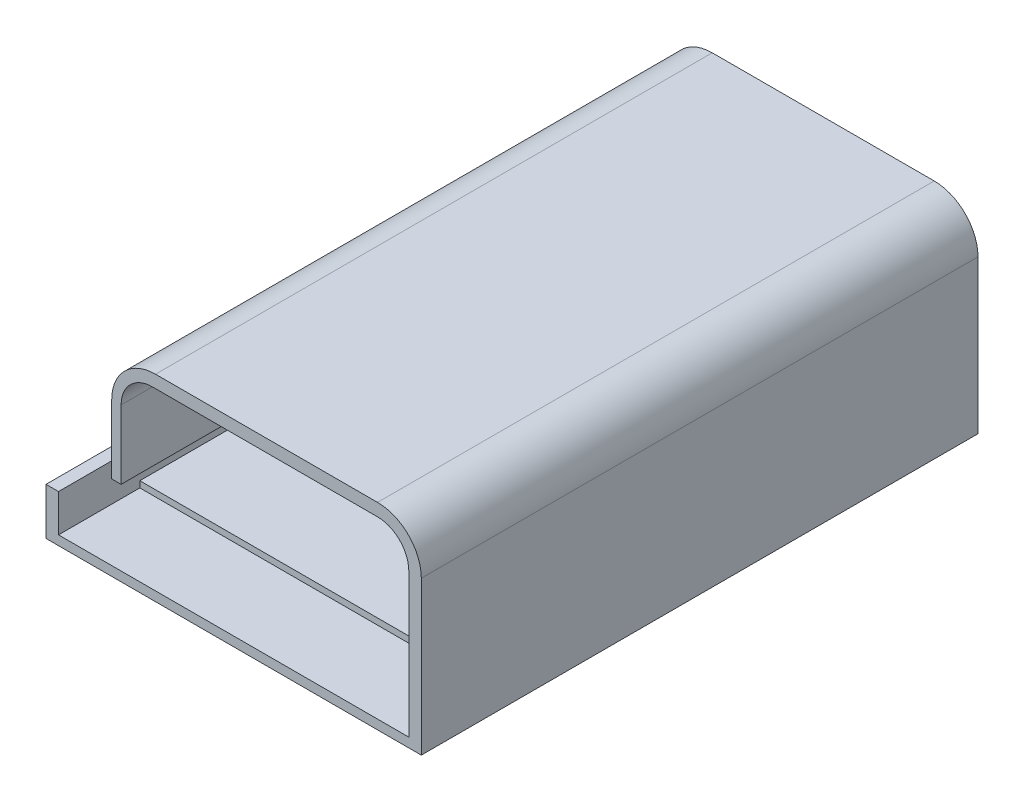
ISO-10303-21;
HEADER;
FILE_DESCRIPTION(('STEP AP214'),'2;1');
FILE_NAME('part.step','',(''),(''),'','','');
FILE_SCHEMA(('AUTOMOTIVE_DESIGN { 1 0 10303 214 1 1 1 1 }'));
ENDSEC;
DATA;
#1=APPLICATION_CONTEXT('core data for automotive mechanical design processes');
#2=APPLICATION_PROTOCOL_DEFINITION('international standard','automotive_design',2000,#1);
#3=PRODUCT_CONTEXT('',#1,'mechanical');
#4=PRODUCT('Part','Part','',(#3));
#5=PRODUCT_RELATED_PRODUCT_CATEGORY('part','',(#4));
#6=PRODUCT_DEFINITION_FORMATION('','',#4);
#7=PRODUCT_DEFINITION_CONTEXT('part definition',#1,'design');
#8=PRODUCT_DEFINITION('design','',#6,#7);
#9=PRODUCT_DEFINITION_SHAPE('','',#8);
#10=(LENGTH_UNIT() NAMED_UNIT(*) SI_UNIT(.MILLI.,.METRE.));
#11=(NAMED_UNIT(*) PLANE_ANGLE_UNIT() SI_UNIT($,.RADIAN.));
#12=(NAMED_UNIT(*) SI_UNIT($,.STERADIAN.) SOLID_ANGLE_UNIT());
#13=UNCERTAINTY_MEASURE_WITH_UNIT(LENGTH_MEASURE(1.E-05),#10,'distance_accuracy_value','');
#14=(GEOMETRIC_REPRESENTATION_CONTEXT(3) GLOBAL_UNCERTAINTY_ASSIGNED_CONTEXT((#13)) GLOBAL_UNIT_ASSIGNED_CONTEXT((#10,
#11,#12)) REPRESENTATION_CONTEXT('',''));
#15=CARTESIAN_POINT('',(0.,0.,0.));
#16=DIRECTION('',(0.,0.,1.));
#17=DIRECTION('',(1.,0.,0.));
#18=AXIS2_PLACEMENT_3D('',#15,#16,#17);
#19=CARTESIAN_POINT('',(0.,0.527555179918766,-84.));
#20=DIRECTION('',(1.,0.,0.));
#21=DIRECTION('',(0.,0.,-1.));
#22=AXIS2_PLACEMENT_3D('',#19,#20,#21);
#23=PLANE('',#22);
#24=DIRECTION('',(0.,0.,1.));
#25=VECTOR('',#24,1.);
#26=CARTESIAN_POINT('',(0.,0.527555179918766,-84.));
#27=LINE('',#26,#25);
#28=CARTESIAN_POINT('',(0.,0.527555179918766,-83.));
#29=VERTEX_POINT('',#28);
#30=CARTESIAN_POINT('',(0.,0.527555179918766,-10.));
#31=VERTEX_POINT('',#30);
#32=EDGE_CURVE('E348',#29,#31,#27,.T.);
#33=ORIENTED_EDGE('',*,*,#32,.F.);
#34=CARTESIAN_POINT('',(0.,1.52755517991877,-83.));
#35=DIRECTION('',(1.,0.,0.));
#36=DIRECTION('',(0.,0.,-1.));
#37=AXIS2_PLACEMENT_3D('',#34,#35,#36);
#38=CIRCLE('',#37,1.);
#39=CARTESIAN_POINT('',(0.,1.52755517991877,-84.));
#40=VERTEX_POINT('',#39);
#41=EDGE_CURVE('E436',#29,#40,#38,.T.);
#42=ORIENTED_EDGE('',*,*,#41,.T.);
#43=DIRECTION('',(0.,1.,0.));
#44=VECTOR('',#43,1.);
#45=CARTESIAN_POINT('',(0.,0.527555179918766,-84.));
#46=LINE('',#45,#44);
#47=CARTESIAN_POINT('',(0.,5.52755517991876,-84.));
#48=VERTEX_POINT('',#47);
#49=EDGE_CURVE('E341',#40,#48,#46,.T.);
#50=ORIENTED_EDGE('',*,*,#49,.T.);
#51=DIRECTION('',(0.,0.,1.));
#52=VECTOR('',#51,1.);
#53=CARTESIAN_POINT('',(0.,5.52755517991876,-84.));
#54=LINE('',#53,#52);
#55=CARTESIAN_POINT('',(0.,5.52755517991876,3.));
#56=VERTEX_POINT('',#55);
#57=EDGE_CURVE('E347',#48,#56,#54,.T.);
#58=ORIENTED_EDGE('',*,*,#57,.T.);
#59=DIRECTION('',(0.,1.,0.));
#60=VECTOR('',#59,1.);
#61=CARTESIAN_POINT('',(0.,-0.472444820081234,3.));
#62=LINE('',#61,#60);
#63=CARTESIAN_POINT('',(0.,-0.472444820081234,3.));
#64=VERTEX_POINT('',#63);
#65=EDGE_CURVE('E239',#64,#56,#62,.T.);
#66=ORIENTED_EDGE('',*,*,#65,.F.);
#67=DIRECTION('',(0.,0.,1.));
#68=VECTOR('',#67,1.);
#69=CARTESIAN_POINT('',(0.,-0.472444820081234,-10.));
#70=LINE('',#69,#68);
#71=CARTESIAN_POINT('',(0.,-0.472444820081234,-10.));
#72=VERTEX_POINT('',#71);
#73=EDGE_CURVE('E304',#72,#64,#70,.T.);
#74=ORIENTED_EDGE('',*,*,#73,.F.);
#75=DIRECTION('',(0.,-1.,0.));
#76=VECTOR('',#75,1.);
#77=CARTESIAN_POINT('',(0.,-0.472444820081234,-10.));
#78=LINE('',#77,#76);
#79=EDGE_CURVE('E292',#31,#72,#78,.T.);
#80=ORIENTED_EDGE('',*,*,#79,.F.);
#81=EDGE_LOOP('',(#33,#42,#50,#58,#66,#74,#80));
#82=FACE_BOUND('',#81,.T.);
#83=ADVANCED_FACE('F41',(#82),#23,.T.);
#84=CARTESIAN_POINT('',(0.,0.527555179918766,-84.));
#85=DIRECTION('',(0.,1.,0.));
#86=DIRECTION('',(0.,0.,1.));
#87=AXIS2_PLACEMENT_3D('',#84,#85,#86);
#88=PLANE('',#87);
#89=DIRECTION('',(0.,0.,1.));
#90=VECTOR('',#89,1.);
#91=CARTESIAN_POINT('',(56.,0.527555179918766,-84.));
#92=LINE('',#91,#90);
#93=CARTESIAN_POINT('',(56.,0.527555179918766,-83.));
#94=VERTEX_POINT('',#93);
#95=CARTESIAN_POINT('',(56.,0.527555179918766,-10.));
#96=VERTEX_POINT('',#95);
#97=EDGE_CURVE('E352',#94,#96,#92,.T.);
#98=ORIENTED_EDGE('',*,*,#97,.F.);
#99=DIRECTION('',(-1.,0.,0.));
#100=VECTOR('',#99,1.);
#101=CARTESIAN_POINT('',(0.,0.527555179918766,-83.));
#102=LINE('',#101,#100);
#103=EDGE_CURVE('E433',#94,#29,#102,.T.);
#104=ORIENTED_EDGE('',*,*,#103,.T.);
#105=ORIENTED_EDGE('',*,*,#32,.T.);
#106=DIRECTION('',(-1.,0.,0.));
#107=VECTOR('',#106,1.);
#108=CARTESIAN_POINT('',(0.,0.527555179918766,-10.));
#109=LINE('',#108,#107);
#110=EDGE_CURVE('E288',#96,#31,#109,.T.);
#111=ORIENTED_EDGE('',*,*,#110,.F.);
#112=EDGE_LOOP('',(#98,#104,#105,#111));
#113=FACE_BOUND('',#112,.T.);
#114=ADVANCED_FACE('F533',(#113),#88,.T.);
#115=CARTESIAN_POINT('',(56.,0.527555179918766,-84.));
#116=DIRECTION('',(-1.,0.,0.));
#117=DIRECTION('',(0.,0.,1.));
#118=AXIS2_PLACEMENT_3D('',#115,#116,#117);
#119=PLANE('',#118);
#120=DIRECTION('',(0.,0.,1.));
#121=VECTOR('',#120,1.);
#122=CARTESIAN_POINT('',(56.,22.5275551799188,-84.));
#123=LINE('',#122,#121);
#124=CARTESIAN_POINT('',(56.,22.5275551799188,3.));
#125=VERTEX_POINT('',#124);
#126=CARTESIAN_POINT('',(56.,22.5275551799188,-83.));
#127=VERTEX_POINT('',#126);
#128=EDGE_CURVE('E199',#125,#127,#123,.F.);
#129=ORIENTED_EDGE('',*,*,#128,.T.);
#130=DIRECTION('',(0.,-1.,0.));
#131=VECTOR('',#130,1.);
#132=CARTESIAN_POINT('',(56.,0.527555179918766,-83.));
#133=LINE('',#132,#131);
#134=EDGE_CURVE('E428',#127,#94,#133,.T.);
#135=ORIENTED_EDGE('',*,*,#134,.T.);
#136=ORIENTED_EDGE('',*,*,#97,.T.);
#137=DIRECTION('',(0.,1.,0.));
#138=VECTOR('',#137,1.);
#139=CARTESIAN_POINT('',(56.,0.527555179918766,-10.));
#140=LINE('',#139,#138);
#141=CARTESIAN_POINT('',(56.,-0.472444820081234,-10.));
#142=VERTEX_POINT('',#141);
#143=EDGE_CURVE('E300',#142,#96,#140,.T.);
#144=ORIENTED_EDGE('',*,*,#143,.F.);
#145=DIRECTION('',(0.,0.,1.));
#146=VECTOR('',#145,1.);
#147=CARTESIAN_POINT('',(56.,-0.472444820081234,-10.));
#148=LINE('',#147,#146);
#149=CARTESIAN_POINT('',(56.,-0.472444820081234,3.));
#150=VERTEX_POINT('',#149);
#151=EDGE_CURVE('E217',#142,#150,#148,.T.);
#152=ORIENTED_EDGE('',*,*,#151,.T.);
#153=DIRECTION('',(0.,-1.,0.));
#154=VECTOR('',#153,1.);
#155=CARTESIAN_POINT('',(56.,22.5275551799188,3.));
#156=LINE('',#155,#154);
#157=EDGE_CURVE('E214',#125,#150,#156,.T.);
#158=ORIENTED_EDGE('',*,*,#157,.F.);
#159=EDGE_LOOP('',(#129,#135,#136,#144,#152,#158));
#160=FACE_BOUND('',#159,.T.);
#161=ADVANCED_FACE('F215',(#160),#119,.T.);
#162=CARTESIAN_POINT('',(56.,27.5275551799188,-84.));
#163=DIRECTION('',(0.,-1.,0.));
#164=DIRECTION('',(1.,0.,0.));
#165=AXIS2_PLACEMENT_3D('',#162,#163,#164);
#166=PLANE('',#165);
#167=DIRECTION('',(0.,0.,1.));
#168=VECTOR('',#167,1.);
#169=CARTESIAN_POINT('',(15.009451629027,27.5275551799188,-84.));
#170=LINE('',#169,#168);
#171=CARTESIAN_POINT('',(15.009451629027,27.5275551799188,3.));
#172=VERTEX_POINT('',#171);
#173=CARTESIAN_POINT('',(15.009451629027,27.5275551799188,-83.));
#174=VERTEX_POINT('',#173);
#175=EDGE_CURVE('E374',#172,#174,#170,.F.);
#176=ORIENTED_EDGE('',*,*,#175,.T.);
#177=DIRECTION('',(1.,0.,0.));
#178=VECTOR('',#177,1.);
#179=CARTESIAN_POINT('',(56.,27.5275551799188,-83.));
#180=LINE('',#179,#178);
#181=CARTESIAN_POINT('',(51.,27.5275551799188,-83.));
#182=VERTEX_POINT('',#181);
#183=EDGE_CURVE('E439',#174,#182,#180,.T.);
#184=ORIENTED_EDGE('',*,*,#183,.T.);
#185=DIRECTION('',(0.,0.,1.));
#186=VECTOR('',#185,1.);
#187=CARTESIAN_POINT('',(51.,27.5275551799188,0.));
#188=LINE('',#187,#186);
#189=CARTESIAN_POINT('',(51.,27.5275551799188,3.));
#190=VERTEX_POINT('',#189);
#191=EDGE_CURVE('E211',#182,#190,#188,.T.);
#192=ORIENTED_EDGE('',*,*,#191,.T.);
#193=DIRECTION('',(1.,0.,0.));
#194=VECTOR('',#193,1.);
#195=CARTESIAN_POINT('',(15.009451629027,27.5275551799188,3.));
#196=LINE('',#195,#194);
#197=EDGE_CURVE('E228',#172,#190,#196,.T.);
#198=ORIENTED_EDGE('',*,*,#197,.F.);
#199=EDGE_LOOP('',(#176,#184,#192,#198));
#200=FACE_BOUND('',#199,.T.);
#201=ADVANCED_FACE('F524',(#200),#166,.T.);
#202=CARTESIAN_POINT('',(10.009451629027,27.5275551799188,-84.));
#203=DIRECTION('',(1.,0.,0.));
#204=DIRECTION('',(0.,1.,0.));
#205=AXIS2_PLACEMENT_3D('',#202,#203,#204);
#206=PLANE('',#205);
#207=DIRECTION('',(0.,0.,1.));
#208=VECTOR('',#207,1.);
#209=CARTESIAN_POINT('',(10.009451629027,11.5275551799188,-84.));
#210=LINE('',#209,#208);
#211=CARTESIAN_POINT('',(10.009451629027,11.5275551799188,-83.));
#212=VERTEX_POINT('',#211);
#213=CARTESIAN_POINT('',(10.009451629027,11.5275551799188,3.));
#214=VERTEX_POINT('',#213);
#215=EDGE_CURVE('E355',#212,#214,#210,.T.);
#216=ORIENTED_EDGE('',*,*,#215,.F.);
#217=DIRECTION('',(0.,1.,0.));
#218=VECTOR('',#217,1.);
#219=CARTESIAN_POINT('',(10.009451629027,27.5275551799188,-83.));
#220=LINE('',#219,#218);
#221=CARTESIAN_POINT('',(10.009451629027,22.5275551799188,-83.));
#222=VERTEX_POINT('',#221);
#223=EDGE_CURVE('E404',#212,#222,#220,.T.);
#224=ORIENTED_EDGE('',*,*,#223,.T.);
#225=DIRECTION('',(0.,0.,1.));
#226=VECTOR('',#225,1.);
#227=CARTESIAN_POINT('',(10.009451629027,22.5275551799188,0.));
#228=LINE('',#227,#226);
#229=CARTESIAN_POINT('',(10.009451629027,22.5275551799188,3.));
#230=VERTEX_POINT('',#229);
#231=EDGE_CURVE('E351',#222,#230,#228,.T.);
#232=ORIENTED_EDGE('',*,*,#231,.T.);
#233=DIRECTION('',(0.,1.,0.));
#234=VECTOR('',#233,1.);
#235=CARTESIAN_POINT('',(10.009451629027,11.5275551799188,3.));
#236=LINE('',#235,#234);
#237=EDGE_CURVE('E279',#214,#230,#236,.T.);
#238=ORIENTED_EDGE('',*,*,#237,.F.);
#239=EDGE_LOOP('',(#216,#224,#232,#238));
#240=FACE_BOUND('',#239,.T.);
#241=ADVANCED_FACE('F519',(#240),#206,.T.);
#242=CARTESIAN_POINT('',(10.009451629027,11.5275551799188,-84.));
#243=DIRECTION('',(0.,-1.,0.));
#244=DIRECTION('',(0.,0.,-1.));
#245=AXIS2_PLACEMENT_3D('',#242,#243,#244);
#246=PLANE('',#245);
#247=DIRECTION('',(0.,0.,1.));
#248=VECTOR('',#247,1.);
#249=CARTESIAN_POINT('',(8.50945162902703,11.5275551799188,-84.));
#250=LINE('',#249,#248);
#251=CARTESIAN_POINT('',(8.50945162902703,11.5275551799188,-83.));
#252=VERTEX_POINT('',#251);
#253=CARTESIAN_POINT('',(8.50945162902703,11.5275551799188,3.));
#254=VERTEX_POINT('',#253);
#255=EDGE_CURVE('E358',#252,#254,#250,.T.);
#256=ORIENTED_EDGE('',*,*,#255,.F.);
#257=DIRECTION('',(1.,0.,0.));
#258=VECTOR('',#257,1.);
#259=CARTESIAN_POINT('',(10.009451629027,11.5275551799188,-83.));
#260=LINE('',#259,#258);
#261=EDGE_CURVE('E442',#252,#212,#260,.T.);
#262=ORIENTED_EDGE('',*,*,#261,.T.);
#263=ORIENTED_EDGE('',*,*,#215,.T.);
#264=DIRECTION('',(1.,0.,0.));
#265=VECTOR('',#264,1.);
#266=CARTESIAN_POINT('',(8.50945162902703,11.5275551799188,3.));
#267=LINE('',#266,#265);
#268=EDGE_CURVE('E275',#254,#214,#267,.T.);
#269=ORIENTED_EDGE('',*,*,#268,.F.);
#270=EDGE_LOOP('',(#256,#262,#263,#269));
#271=FACE_BOUND('',#270,.T.);
#272=ADVANCED_FACE('F531',(#271),#246,.T.);
#273=CARTESIAN_POINT('',(8.50945162902703,11.5275551799188,-84.));
#274=DIRECTION('',(-1.,0.,0.));
#275=DIRECTION('',(0.,0.,1.));
#276=AXIS2_PLACEMENT_3D('',#273,#274,#275);
#277=PLANE('',#276);
#278=DIRECTION('',(0.,1.,0.));
#279=VECTOR('',#278,1.);
#280=CARTESIAN_POINT('',(8.50945162902703,11.5275551799188,-86.));
#281=LINE('',#280,#279);
#282=CARTESIAN_POINT('',(8.50945162902703,10.5275551799188,-86.));
#283=VERTEX_POINT('',#282);
#284=CARTESIAN_POINT('',(8.50945162902703,22.5275551799188,-86.));
#285=VERTEX_POINT('',#284);
#286=EDGE_CURVE('E338',#283,#285,#281,.T.);
#287=ORIENTED_EDGE('',*,*,#286,.F.);
#288=DIRECTION('',(0.,0.,1.));
#289=VECTOR('',#288,1.);
#290=CARTESIAN_POINT('',(8.50945162902703,10.5275551799188,-84.));
#291=LINE('',#290,#289);
#292=CARTESIAN_POINT('',(8.50945162902703,10.5275551799188,-84.));
#293=VERTEX_POINT('',#292);
#294=EDGE_CURVE('E210',#283,#293,#291,.T.);
#295=ORIENTED_EDGE('',*,*,#294,.T.);
#296=CARTESIAN_POINT('',(8.50945162902703,10.5275551799188,-83.));
#297=DIRECTION('',(-1.,0.,0.));
#298=DIRECTION('',(0.,0.,1.));
#299=AXIS2_PLACEMENT_3D('',#296,#297,#298);
#300=CIRCLE('',#299,1.);
#301=EDGE_CURVE('E12',#293,#252,#300,.F.);
#302=ORIENTED_EDGE('',*,*,#301,.T.);
#303=ORIENTED_EDGE('',*,*,#255,.T.);
#304=DIRECTION('',(0.,-1.,0.));
#305=VECTOR('',#304,1.);
#306=CARTESIAN_POINT('',(8.50945162902703,22.5275551799188,3.));
#307=LINE('',#306,#305);
#308=CARTESIAN_POINT('',(8.50945162902703,22.5275551799188,3.));
#309=VERTEX_POINT('',#308);
#310=EDGE_CURVE('E271',#309,#254,#307,.T.);
#311=ORIENTED_EDGE('',*,*,#310,.F.);
#312=DIRECTION('',(0.,0.,1.));
#313=VECTOR('',#312,1.);
#314=CARTESIAN_POINT('',(8.50945162902703,22.5275551799188,-84.));
#315=LINE('',#314,#313);
#316=EDGE_CURVE('E381',#309,#285,#315,.F.);
#317=ORIENTED_EDGE('',*,*,#316,.T.);
#318=EDGE_LOOP('',(#287,#295,#302,#303,#311,#317));
#319=FACE_BOUND('',#318,.T.);
#320=ADVANCED_FACE('F479',(#319),#277,.T.);
#321=CARTESIAN_POINT('',(8.50945162902703,29.5275551799188,-84.));
#322=DIRECTION('',(0.,1.,0.));
#323=DIRECTION('',(0.,0.,1.));
#324=AXIS2_PLACEMENT_3D('',#321,#322,#323);
#325=PLANE('',#324);
#326=DIRECTION('',(0.,0.,1.));
#327=VECTOR('',#326,1.);
#328=CARTESIAN_POINT('',(15.509451629027,29.5275551799188,-84.));
#329=LINE('',#328,#327);
#330=CARTESIAN_POINT('',(15.509451629027,29.5275551799188,-86.));
#331=VERTEX_POINT('',#330);
#332=CARTESIAN_POINT('',(15.509451629027,29.5275551799188,3.));
#333=VERTEX_POINT('',#332);
#334=EDGE_CURVE('E378',#331,#333,#329,.T.);
#335=ORIENTED_EDGE('',*,*,#334,.T.);
#336=DIRECTION('',(-1.,0.,0.));
#337=VECTOR('',#336,1.);
#338=CARTESIAN_POINT('',(51.,29.5275551799188,3.));
#339=LINE('',#338,#337);
#340=CARTESIAN_POINT('',(51.,29.5275551799188,3.));
#341=VERTEX_POINT('',#340);
#342=EDGE_CURVE('E263',#341,#333,#339,.T.);
#343=ORIENTED_EDGE('',*,*,#342,.F.);
#344=DIRECTION('',(0.,0.,1.));
#345=VECTOR('',#344,1.);
#346=CARTESIAN_POINT('',(51.,29.5275551799188,-84.));
#347=LINE('',#346,#345);
#348=CARTESIAN_POINT('',(51.,29.5275551799188,-86.));
#349=VERTEX_POINT('',#348);
#350=EDGE_CURVE('E388',#341,#349,#347,.F.);
#351=ORIENTED_EDGE('',*,*,#350,.T.);
#352=DIRECTION('',(1.,0.,0.));
#353=VECTOR('',#352,1.);
#354=CARTESIAN_POINT('',(15.509451629027,29.5275551799188,-86.));
#355=LINE('',#354,#353);
#356=EDGE_CURVE('E314',#331,#349,#355,.T.);
#357=ORIENTED_EDGE('',*,*,#356,.F.);
#358=EDGE_LOOP('',(#335,#343,#351,#357));
#359=FACE_BOUND('',#358,.T.);
#360=ADVANCED_FACE('F724',(#359),#325,.T.);
#361=CARTESIAN_POINT('',(58.,29.5275551799188,-84.));
#362=DIRECTION('',(1.,0.,0.));
#363=DIRECTION('',(0.,1.,0.));
#364=AXIS2_PLACEMENT_3D('',#361,#362,#363);
#365=PLANE('',#364);
#366=DIRECTION('',(0.,0.,1.));
#367=VECTOR('',#366,1.);
#368=CARTESIAN_POINT('',(58.,-1.97244482008123,-84.));
#369=LINE('',#368,#367);
#370=CARTESIAN_POINT('',(58.,-1.97244482008123,-86.));
#371=VERTEX_POINT('',#370);
#372=CARTESIAN_POINT('',(58.,-1.97244482008123,3.));
#373=VERTEX_POINT('',#372);
#374=EDGE_CURVE('E361',#371,#373,#369,.T.);
#375=ORIENTED_EDGE('',*,*,#374,.F.);
#376=DIRECTION('',(0.,-1.,0.));
#377=VECTOR('',#376,1.);
#378=CARTESIAN_POINT('',(58.,22.5275551799188,-86.));
#379=LINE('',#378,#377);
#380=CARTESIAN_POINT('',(58.,22.5275551799188,-86.));
#381=VERTEX_POINT('',#380);
#382=EDGE_CURVE('E322',#381,#371,#379,.T.);
#383=ORIENTED_EDGE('',*,*,#382,.F.);
#384=DIRECTION('',(0.,0.,1.));
#385=VECTOR('',#384,1.);
#386=CARTESIAN_POINT('',(58.,22.5275551799188,-84.));
#387=LINE('',#386,#385);
#388=CARTESIAN_POINT('',(58.,22.5275551799188,3.));
#389=VERTEX_POINT('',#388);
#390=EDGE_CURVE('E385',#381,#389,#387,.T.);
#391=ORIENTED_EDGE('',*,*,#390,.T.);
#392=DIRECTION('',(0.,1.,0.));
#393=VECTOR('',#392,1.);
#394=CARTESIAN_POINT('',(58.,-1.97244482008123,3.));
#395=LINE('',#394,#393);
#396=EDGE_CURVE('E255',#373,#389,#395,.T.);
#397=ORIENTED_EDGE('',*,*,#396,.F.);
#398=EDGE_LOOP('',(#375,#383,#391,#397));
#399=FACE_BOUND('',#398,.T.);
#400=ADVANCED_FACE('F711',(#399),#365,.T.);
#401=CARTESIAN_POINT('',(-2.,-1.97244482008123,-84.));
#402=DIRECTION('',(0.,-1.,0.));
#403=DIRECTION('',(0.,0.,-1.));
#404=AXIS2_PLACEMENT_3D('',#401,#402,#403);
#405=PLANE('',#404);
#406=ORIENTED_EDGE('',*,*,#374,.T.);
#407=DIRECTION('',(1.,0.,0.));
#408=VECTOR('',#407,1.);
#409=CARTESIAN_POINT('',(-2.,-1.97244482008123,3.));
#410=LINE('',#409,#408);
#411=CARTESIAN_POINT('',(-2.,-1.97244482008123,3.));
#412=VERTEX_POINT('',#411);
#413=EDGE_CURVE('E251',#412,#373,#410,.T.);
#414=ORIENTED_EDGE('',*,*,#413,.F.);
#415=DIRECTION('',(0.,0.,1.));
#416=VECTOR('',#415,1.);
#417=CARTESIAN_POINT('',(-2.,-1.97244482008123,-84.));
#418=LINE('',#417,#416);
#419=CARTESIAN_POINT('',(-2.,-1.97244482008123,-86.));
#420=VERTEX_POINT('',#419);
#421=EDGE_CURVE('E364',#420,#412,#418,.T.);
#422=ORIENTED_EDGE('',*,*,#421,.F.);
#423=DIRECTION('',(-1.,0.,0.));
#424=VECTOR('',#423,1.);
#425=CARTESIAN_POINT('',(58.,-1.97244482008123,-86.));
#426=LINE('',#425,#424);
#427=EDGE_CURVE('E326',#371,#420,#426,.T.);
#428=ORIENTED_EDGE('',*,*,#427,.F.);
#429=EDGE_LOOP('',(#406,#414,#422,#428));
#430=FACE_BOUND('',#429,.T.);
#431=ADVANCED_FACE('F699',(#430),#405,.T.);
#432=CARTESIAN_POINT('',(-2.,5.52755517991876,-84.));
#433=DIRECTION('',(-1.,0.,0.));
#434=DIRECTION('',(0.,-1.,0.));
#435=AXIS2_PLACEMENT_3D('',#432,#433,#434);
#436=PLANE('',#435);
#437=ORIENTED_EDGE('',*,*,#421,.T.);
#438=DIRECTION('',(0.,-1.,0.));
#439=VECTOR('',#438,1.);
#440=CARTESIAN_POINT('',(-2.,5.52755517991876,3.));
#441=LINE('',#440,#439);
#442=CARTESIAN_POINT('',(-2.,5.52755517991876,3.));
#443=VERTEX_POINT('',#442);
#444=EDGE_CURVE('E247',#443,#412,#441,.T.);
#445=ORIENTED_EDGE('',*,*,#444,.F.);
#446=DIRECTION('',(0.,0.,1.));
#447=VECTOR('',#446,1.);
#448=CARTESIAN_POINT('',(-2.,5.52755517991876,-84.));
#449=LINE('',#448,#447);
#450=CARTESIAN_POINT('',(-2.,5.52755517991876,-86.));
#451=VERTEX_POINT('',#450);
#452=EDGE_CURVE('E367',#451,#443,#449,.T.);
#453=ORIENTED_EDGE('',*,*,#452,.F.);
#454=DIRECTION('',(0.,1.,0.));
#455=VECTOR('',#454,1.);
#456=CARTESIAN_POINT('',(-2.,-1.97244482008123,-86.));
#457=LINE('',#456,#455);
#458=EDGE_CURVE('E330',#420,#451,#457,.T.);
#459=ORIENTED_EDGE('',*,*,#458,.F.);
#460=EDGE_LOOP('',(#437,#445,#453,#459));
#461=FACE_BOUND('',#460,.T.);
#462=ADVANCED_FACE('F688',(#461),#436,.T.);
#463=CARTESIAN_POINT('',(0.,5.52755517991876,-84.));
#464=DIRECTION('',(0.,1.,0.));
#465=DIRECTION('',(0.,0.,1.));
#466=AXIS2_PLACEMENT_3D('',#463,#464,#465);
#467=PLANE('',#466);
#468=DIRECTION('',(1.,0.,0.));
#469=VECTOR('',#468,1.);
#470=CARTESIAN_POINT('',(8.50945162902703,5.52755517991876,-84.));
#471=LINE('',#470,#469);
#472=CARTESIAN_POINT('',(3.50945162902703,5.52755517991876,-84.));
#473=VERTEX_POINT('',#472);
#474=EDGE_CURVE('E307',#48,#473,#471,.T.);
#475=ORIENTED_EDGE('',*,*,#474,.T.);
#476=DIRECTION('',(0.,0.,1.));
#477=VECTOR('',#476,1.);
#478=CARTESIAN_POINT('',(3.50945162902703,5.52755517991876,-86.));
#479=LINE('',#478,#477);
#480=CARTESIAN_POINT('',(3.50945162902703,5.52755517991876,-86.));
#481=VERTEX_POINT('',#480);
#482=EDGE_CURVE('E395',#473,#481,#479,.F.);
#483=ORIENTED_EDGE('',*,*,#482,.T.);
#484=DIRECTION('',(1.,0.,0.));
#485=VECTOR('',#484,1.);
#486=CARTESIAN_POINT('',(0.,5.52755517991876,-86.));
#487=LINE('',#486,#485);
#488=EDGE_CURVE('E334',#451,#481,#487,.T.);
#489=ORIENTED_EDGE('',*,*,#488,.F.);
#490=ORIENTED_EDGE('',*,*,#452,.T.);
#491=DIRECTION('',(-1.,0.,0.));
#492=VECTOR('',#491,1.);
#493=CARTESIAN_POINT('',(0.,5.52755517991876,3.));
#494=LINE('',#493,#492);
#495=EDGE_CURVE('E243',#56,#443,#494,.T.);
#496=ORIENTED_EDGE('',*,*,#495,.F.);
#497=ORIENTED_EDGE('',*,*,#57,.F.);
#498=EDGE_LOOP('',(#475,#483,#489,#490,#496,#497));
#499=FACE_BOUND('',#498,.T.);
#500=ADVANCED_FACE('F487',(#499),#467,.T.);
#501=CARTESIAN_POINT('',(15.009451629027,22.5275551799188,-84.));
#502=DIRECTION('',(0.,0.,-1.));
#503=DIRECTION('',(-1.,0.,0.));
#504=AXIS2_PLACEMENT_3D('',#501,#502,#503);
#505=CYLINDRICAL_SURFACE('',#504,5.);
#506=ORIENTED_EDGE('',*,*,#231,.F.);
#507=CARTESIAN_POINT('',(15.009451629027,22.5275551799188,-83.));
#508=DIRECTION('',(0.,0.,-1.));
#509=DIRECTION('',(-1.,0.,0.));
#510=AXIS2_PLACEMENT_3D('',#507,#508,#509);
#511=CIRCLE('',#510,5.);
#512=EDGE_CURVE('E425',#222,#174,#511,.T.);
#513=ORIENTED_EDGE('',*,*,#512,.T.);
#514=ORIENTED_EDGE('',*,*,#175,.F.);
#515=CARTESIAN_POINT('',(15.009451629027,22.5275551799188,3.));
#516=DIRECTION('',(0.,0.,-1.));
#517=DIRECTION('',(1.,0.,0.));
#518=AXIS2_PLACEMENT_3D('',#515,#516,#517);
#519=CIRCLE('',#518,5.);
#520=EDGE_CURVE('E283',#230,#172,#519,.T.);
#521=ORIENTED_EDGE('',*,*,#520,.F.);
#522=EDGE_LOOP('',(#506,#513,#514,#521));
#523=FACE_BOUND('',#522,.T.);
#524=ADVANCED_FACE('F522',(#523),#505,.F.);
#525=CARTESIAN_POINT('',(15.509451629027,22.5275551799188,-84.));
#526=DIRECTION('',(0.,0.,1.));
#527=DIRECTION('',(1.,0.,0.));
#528=AXIS2_PLACEMENT_3D('',#525,#526,#527);
#529=CYLINDRICAL_SURFACE('',#528,7.);
#530=ORIENTED_EDGE('',*,*,#334,.F.);
#531=CARTESIAN_POINT('',(15.509451629027,22.5275551799188,-86.));
#532=DIRECTION('',(0.,0.,-1.));
#533=DIRECTION('',(-1.,0.,0.));
#534=AXIS2_PLACEMENT_3D('',#531,#532,#533);
#535=CIRCLE('',#534,7.);
#536=EDGE_CURVE('E310',#285,#331,#535,.T.);
#537=ORIENTED_EDGE('',*,*,#536,.F.);
#538=ORIENTED_EDGE('',*,*,#316,.F.);
#539=CARTESIAN_POINT('',(15.509451629027,22.5275551799188,3.));
#540=DIRECTION('',(0.,0.,1.));
#541=DIRECTION('',(1.,0.,0.));
#542=AXIS2_PLACEMENT_3D('',#539,#540,#541);
#543=CIRCLE('',#542,7.);
#544=EDGE_CURVE('E267',#333,#309,#543,.T.);
#545=ORIENTED_EDGE('',*,*,#544,.F.);
#546=EDGE_LOOP('',(#530,#537,#538,#545));
#547=FACE_BOUND('',#546,.T.);
#548=ADVANCED_FACE('F548',(#547),#529,.T.);
#549=CARTESIAN_POINT('',(51.,22.5275551799188,-84.));
#550=DIRECTION('',(0.,0.,1.));
#551=DIRECTION('',(1.,0.,0.));
#552=AXIS2_PLACEMENT_3D('',#549,#550,#551);
#553=CYLINDRICAL_SURFACE('',#552,7.);
#554=ORIENTED_EDGE('',*,*,#390,.F.);
#555=CARTESIAN_POINT('',(51.,22.5275551799188,-86.));
#556=DIRECTION('',(0.,0.,-1.));
#557=DIRECTION('',(-1.,0.,0.));
#558=AXIS2_PLACEMENT_3D('',#555,#556,#557);
#559=CIRCLE('',#558,7.);
#560=EDGE_CURVE('E318',#349,#381,#559,.T.);
#561=ORIENTED_EDGE('',*,*,#560,.F.);
#562=ORIENTED_EDGE('',*,*,#350,.F.);
#563=CARTESIAN_POINT('',(51.,22.5275551799188,3.));
#564=DIRECTION('',(0.,0.,1.));
#565=DIRECTION('',(1.,0.,0.));
#566=AXIS2_PLACEMENT_3D('',#563,#564,#565);
#567=CIRCLE('',#566,7.);
#568=EDGE_CURVE('E259',#389,#341,#567,.T.);
#569=ORIENTED_EDGE('',*,*,#568,.F.);
#570=EDGE_LOOP('',(#554,#561,#562,#569));
#571=FACE_BOUND('',#570,.T.);
#572=ADVANCED_FACE('F551',(#571),#553,.T.);
#573=CARTESIAN_POINT('',(51.,22.5275551799188,-84.));
#574=DIRECTION('',(0.,0.,-1.));
#575=DIRECTION('',(-1.,0.,0.));
#576=AXIS2_PLACEMENT_3D('',#573,#574,#575);
#577=CYLINDRICAL_SURFACE('',#576,5.);
#578=ORIENTED_EDGE('',*,*,#191,.F.);
#579=CARTESIAN_POINT('',(51.,22.5275551799188,-83.));
#580=DIRECTION('',(0.,0.,-1.));
#581=DIRECTION('',(-1.,0.,0.));
#582=AXIS2_PLACEMENT_3D('',#579,#580,#581);
#583=CIRCLE('',#582,5.);
#584=EDGE_CURVE('E206',#182,#127,#583,.T.);
#585=ORIENTED_EDGE('',*,*,#584,.T.);
#586=ORIENTED_EDGE('',*,*,#128,.F.);
#587=CARTESIAN_POINT('',(51.,22.5275551799188,3.));
#588=DIRECTION('',(0.,0.,-1.));
#589=DIRECTION('',(1.,0.,0.));
#590=AXIS2_PLACEMENT_3D('',#587,#588,#589);
#591=CIRCLE('',#590,5.);
#592=EDGE_CURVE('E204',#190,#125,#591,.T.);
#593=ORIENTED_EDGE('',*,*,#592,.F.);
#594=EDGE_LOOP('',(#578,#585,#586,#593));
#595=FACE_BOUND('',#594,.T.);
#596=ADVANCED_FACE('F202',(#595),#577,.F.);
#597=CARTESIAN_POINT('',(15.509451629027,22.5275551799188,-86.));
#598=DIRECTION('',(0.,0.,-1.));
#599=DIRECTION('',(-1.,0.,0.));
#600=AXIS2_PLACEMENT_3D('',#597,#598,#599);
#601=PLANE('',#600);
#602=ORIENTED_EDGE('',*,*,#536,.T.);
#603=ORIENTED_EDGE('',*,*,#356,.T.);
#604=ORIENTED_EDGE('',*,*,#560,.T.);
#605=ORIENTED_EDGE('',*,*,#382,.T.);
#606=ORIENTED_EDGE('',*,*,#427,.T.);
#607=ORIENTED_EDGE('',*,*,#458,.T.);
#608=ORIENTED_EDGE('',*,*,#488,.T.);
#609=CARTESIAN_POINT('',(3.50945162902703,10.5275551799188,-86.));
#610=DIRECTION('',(0.,0.,-1.));
#611=DIRECTION('',(-1.,0.,0.));
#612=AXIS2_PLACEMENT_3D('',#609,#610,#611);
#613=CIRCLE('',#612,5.);
#614=EDGE_CURVE('E401',#481,#283,#613,.F.);
#615=ORIENTED_EDGE('',*,*,#614,.T.);
#616=ORIENTED_EDGE('',*,*,#286,.T.);
#617=EDGE_LOOP('',(#602,#603,#604,#605,#606,#607,#608,#615,#616));
#618=FACE_BOUND('',#617,.T.);
#619=ADVANCED_FACE('F483',(#618),#601,.T.);
#620=CARTESIAN_POINT('',(15.509451629027,22.5275551799188,-84.));
#621=DIRECTION('',(0.,0.,-1.));
#622=DIRECTION('',(-1.,0.,0.));
#623=AXIS2_PLACEMENT_3D('',#620,#621,#622);
#624=PLANE('',#623);
#625=DIRECTION('',(0.,1.,0.));
#626=VECTOR('',#625,1.);
#627=CARTESIAN_POINT('',(11.009451629027,22.5275551799188,-84.));
#628=LINE('',#627,#626);
#629=CARTESIAN_POINT('',(11.009451629027,22.5275551799188,-84.));
#630=VERTEX_POINT('',#629);
#631=CARTESIAN_POINT('',(11.009451629027,10.5275551799188,-84.));
#632=VERTEX_POINT('',#631);
#633=EDGE_CURVE('E57',#630,#632,#628,.F.);
#634=ORIENTED_EDGE('',*,*,#633,.T.);
#635=DIRECTION('',(1.,0.,0.));
#636=VECTOR('',#635,1.);
#637=CARTESIAN_POINT('',(15.509451629027,10.5275551799188,-84.));
#638=LINE('',#637,#636);
#639=EDGE_CURVE('E460',#632,#293,#638,.F.);
#640=ORIENTED_EDGE('',*,*,#639,.T.);
#641=CARTESIAN_POINT('',(3.50945162902703,10.5275551799188,-84.));
#642=DIRECTION('',(0.,0.,-1.));
#643=DIRECTION('',(-1.,0.,0.));
#644=AXIS2_PLACEMENT_3D('',#641,#642,#643);
#645=CIRCLE('',#644,5.);
#646=EDGE_CURVE('E398',#293,#473,#645,.T.);
#647=ORIENTED_EDGE('',*,*,#646,.T.);
#648=ORIENTED_EDGE('',*,*,#474,.F.);
#649=ORIENTED_EDGE('',*,*,#49,.F.);
#650=DIRECTION('',(-1.,0.,0.));
#651=VECTOR('',#650,1.);
#652=CARTESIAN_POINT('',(15.509451629027,1.52755517991877,-84.));
#653=LINE('',#652,#651);
#654=CARTESIAN_POINT('',(55.,1.52755517991877,-84.));
#655=VERTEX_POINT('',#654);
#656=EDGE_CURVE('E422',#40,#655,#653,.F.);
#657=ORIENTED_EDGE('',*,*,#656,.T.);
#658=DIRECTION('',(0.,-1.,0.));
#659=VECTOR('',#658,1.);
#660=CARTESIAN_POINT('',(55.,22.5275551799188,-84.));
#661=LINE('',#660,#659);
#662=CARTESIAN_POINT('',(55.,22.5275551799188,-84.));
#663=VERTEX_POINT('',#662);
#664=EDGE_CURVE('E414',#655,#663,#661,.F.);
#665=ORIENTED_EDGE('',*,*,#664,.T.);
#666=CARTESIAN_POINT('',(51.,22.5275551799188,-84.));
#667=DIRECTION('',(0.,0.,-1.));
#668=DIRECTION('',(-1.,0.,0.));
#669=AXIS2_PLACEMENT_3D('',#666,#667,#668);
#670=CIRCLE('',#669,4.);
#671=CARTESIAN_POINT('',(51.,26.5275551799188,-84.));
#672=VERTEX_POINT('',#671);
#673=EDGE_CURVE('E411',#663,#672,#670,.F.);
#674=ORIENTED_EDGE('',*,*,#673,.T.);
#675=DIRECTION('',(1.,0.,0.));
#676=VECTOR('',#675,1.);
#677=CARTESIAN_POINT('',(15.509451629027,26.5275551799188,-84.));
#678=LINE('',#677,#676);
#679=CARTESIAN_POINT('',(15.009451629027,26.5275551799188,-84.));
#680=VERTEX_POINT('',#679);
#681=EDGE_CURVE('E408',#672,#680,#678,.F.);
#682=ORIENTED_EDGE('',*,*,#681,.T.);
#683=CARTESIAN_POINT('',(15.009451629027,22.5275551799188,-84.));
#684=DIRECTION('',(0.,0.,-1.));
#685=DIRECTION('',(-1.,0.,0.));
#686=AXIS2_PLACEMENT_3D('',#683,#684,#685);
#687=CIRCLE('',#686,4.);
#688=EDGE_CURVE('E417',#680,#630,#687,.F.);
#689=ORIENTED_EDGE('',*,*,#688,.T.);
#690=EDGE_LOOP('',(#634,#640,#647,#648,#649,#657,#665,#674,#682,#689));
#691=FACE_BOUND('',#690,.T.);
#692=ADVANCED_FACE('F471',(#691),#624,.F.);
#693=CARTESIAN_POINT('',(56.,-0.472444820081234,-10.));
#694=DIRECTION('',(0.,-1.,0.));
#695=DIRECTION('',(0.,0.,-1.));
#696=AXIS2_PLACEMENT_3D('',#693,#694,#695);
#697=PLANE('',#696);
#698=ORIENTED_EDGE('',*,*,#73,.T.);
#699=DIRECTION('',(-1.,0.,0.));
#700=VECTOR('',#699,1.);
#701=CARTESIAN_POINT('',(56.,-0.472444820081234,3.));
#702=LINE('',#701,#700);
#703=EDGE_CURVE('E222',#150,#64,#702,.T.);
#704=ORIENTED_EDGE('',*,*,#703,.F.);
#705=ORIENTED_EDGE('',*,*,#151,.F.);
#706=DIRECTION('',(1.,0.,0.));
#707=VECTOR('',#706,1.);
#708=CARTESIAN_POINT('',(56.,-0.472444820081234,-10.));
#709=LINE('',#708,#707);
#710=EDGE_CURVE('E296',#72,#142,#709,.T.);
#711=ORIENTED_EDGE('',*,*,#710,.F.);
#712=EDGE_LOOP('',(#698,#704,#705,#711));
#713=FACE_BOUND('',#712,.T.);
#714=ADVANCED_FACE('F633',(#713),#697,.F.);
#715=CARTESIAN_POINT('',(0.,0.,-10.));
#716=DIRECTION('',(0.,0.,-1.));
#717=DIRECTION('',(-1.,0.,0.));
#718=AXIS2_PLACEMENT_3D('',#715,#716,#717);
#719=PLANE('',#718);
#720=ORIENTED_EDGE('',*,*,#110,.T.);
#721=ORIENTED_EDGE('',*,*,#79,.T.);
#722=ORIENTED_EDGE('',*,*,#710,.T.);
#723=ORIENTED_EDGE('',*,*,#143,.T.);
#724=EDGE_LOOP('',(#720,#721,#722,#723));
#725=FACE_BOUND('',#724,.T.);
#726=ADVANCED_FACE('F628',(#725),#719,.F.);
#727=CARTESIAN_POINT('',(51.,22.5275551799188,3.));
#728=DIRECTION('',(0.,0.,1.));
#729=DIRECTION('',(1.,0.,0.));
#730=AXIS2_PLACEMENT_3D('',#727,#728,#729);
#731=PLANE('',#730);
#732=ORIENTED_EDGE('',*,*,#592,.T.);
#733=ORIENTED_EDGE('',*,*,#157,.T.);
#734=ORIENTED_EDGE('',*,*,#703,.T.);
#735=ORIENTED_EDGE('',*,*,#65,.T.);
#736=ORIENTED_EDGE('',*,*,#495,.T.);
#737=ORIENTED_EDGE('',*,*,#444,.T.);
#738=ORIENTED_EDGE('',*,*,#413,.T.);
#739=ORIENTED_EDGE('',*,*,#396,.T.);
#740=ORIENTED_EDGE('',*,*,#568,.T.);
#741=ORIENTED_EDGE('',*,*,#342,.T.);
#742=ORIENTED_EDGE('',*,*,#544,.T.);
#743=ORIENTED_EDGE('',*,*,#310,.T.);
#744=ORIENTED_EDGE('',*,*,#268,.T.);
#745=ORIENTED_EDGE('',*,*,#237,.T.);
#746=ORIENTED_EDGE('',*,*,#520,.T.);
#747=ORIENTED_EDGE('',*,*,#197,.T.);
#748=EDGE_LOOP('',(#732,#733,#734,#735,#736,#737,#738,#739,#740,#741,#742,#743,#744,#745,#746,#747));
#749=FACE_BOUND('',#748,.T.);
#750=ADVANCED_FACE('F225',(#749),#731,.T.);
#751=CARTESIAN_POINT('',(3.50945162902703,10.5275551799188,-84.));
#752=DIRECTION('',(0.,0.,-1.));
#753=DIRECTION('',(-1.,0.,0.));
#754=AXIS2_PLACEMENT_3D('',#751,#752,#753);
#755=CYLINDRICAL_SURFACE('',#754,5.);
#756=ORIENTED_EDGE('',*,*,#614,.F.);
#757=ORIENTED_EDGE('',*,*,#482,.F.);
#758=ORIENTED_EDGE('',*,*,#646,.F.);
#759=ORIENTED_EDGE('',*,*,#294,.F.);
#760=EDGE_LOOP('',(#756,#757,#758,#759));
#761=FACE_BOUND('',#760,.T.);
#762=ADVANCED_FACE('F477',(#761),#755,.F.);
#763=CARTESIAN_POINT('',(0.,1.52755517991877,-83.));
#764=DIRECTION('',(-1.,0.,0.));
#765=DIRECTION('',(0.,0.,1.));
#766=AXIS2_PLACEMENT_3D('',#763,#764,#765);
#767=CYLINDRICAL_SURFACE('',#766,1.);
#768=ORIENTED_EDGE('',*,*,#41,.F.);
#769=ORIENTED_EDGE('',*,*,#103,.F.);
#770=CARTESIAN_POINT('',(55.,1.52755517991877,-83.));
#771=DIRECTION('',(-0.707106781186547,-0.707106781186547,0.));
#772=DIRECTION('',(0.707106781186547,-0.707106781186547,0.));
#773=AXIS2_PLACEMENT_3D('',#770,#771,#772);
#774=ELLIPSE('',#773,1.41421356237309,1.);
#775=EDGE_CURVE('E230',#655,#94,#774,.T.);
#776=ORIENTED_EDGE('',*,*,#775,.F.);
#777=ORIENTED_EDGE('',*,*,#656,.F.);
#778=EDGE_LOOP('',(#768,#769,#776,#777));
#779=FACE_BOUND('',#778,.T.);
#780=ADVANCED_FACE('F496',(#779),#767,.F.);
#781=CARTESIAN_POINT('',(55.,0.527555179918766,-83.));
#782=DIRECTION('',(0.,-1.,0.));
#783=DIRECTION('',(0.,0.,-1.));
#784=AXIS2_PLACEMENT_3D('',#781,#782,#783);
#785=CYLINDRICAL_SURFACE('',#784,1.);
#786=ORIENTED_EDGE('',*,*,#775,.T.);
#787=ORIENTED_EDGE('',*,*,#134,.F.);
#788=CARTESIAN_POINT('',(55.,22.5275551799188,-83.));
#789=DIRECTION('',(0.,-1.,0.));
#790=DIRECTION('',(0.,0.,-1.));
#791=AXIS2_PLACEMENT_3D('',#788,#789,#790);
#792=CIRCLE('',#791,1.);
#793=EDGE_CURVE('E234',#663,#127,#792,.T.);
#794=ORIENTED_EDGE('',*,*,#793,.F.);
#795=ORIENTED_EDGE('',*,*,#664,.F.);
#796=EDGE_LOOP('',(#786,#787,#794,#795));
#797=FACE_BOUND('',#796,.T.);
#798=ADVANCED_FACE('F501',(#797),#785,.F.);
#799=CARTESIAN_POINT('',(51.,22.5275551799188,-83.));
#800=DIRECTION('',(0.,0.,-1.));
#801=DIRECTION('',(-1.,0.,0.));
#802=AXIS2_PLACEMENT_3D('',#799,#800,#801);
#803=TOROIDAL_SURFACE('',#802,4.,1.);
#804=ORIENTED_EDGE('',*,*,#793,.T.);
#805=ORIENTED_EDGE('',*,*,#584,.F.);
#806=CARTESIAN_POINT('',(51.,26.5275551799188,-83.));
#807=DIRECTION('',(1.,0.,0.));
#808=DIRECTION('',(0.,0.,-1.));
#809=AXIS2_PLACEMENT_3D('',#806,#807,#808);
#810=CIRCLE('',#809,1.);
#811=EDGE_CURVE('E450',#672,#182,#810,.T.);
#812=ORIENTED_EDGE('',*,*,#811,.F.);
#813=ORIENTED_EDGE('',*,*,#673,.F.);
#814=EDGE_LOOP('',(#804,#805,#812,#813));
#815=FACE_BOUND('',#814,.T.);
#816=ADVANCED_FACE('F507',(#815),#803,.F.);
#817=CARTESIAN_POINT('',(56.,26.5275551799188,-83.));
#818=DIRECTION('',(1.,0.,0.));
#819=DIRECTION('',(0.,1.,0.));
#820=AXIS2_PLACEMENT_3D('',#817,#818,#819);
#821=CYLINDRICAL_SURFACE('',#820,1.);
#822=ORIENTED_EDGE('',*,*,#811,.T.);
#823=ORIENTED_EDGE('',*,*,#183,.F.);
#824=CARTESIAN_POINT('',(15.009451629027,26.5275551799188,-83.));
#825=DIRECTION('',(1.,0.,0.));
#826=DIRECTION('',(0.,0.,-1.));
#827=AXIS2_PLACEMENT_3D('',#824,#825,#826);
#828=CIRCLE('',#827,1.);
#829=EDGE_CURVE('E446',#680,#174,#828,.T.);
#830=ORIENTED_EDGE('',*,*,#829,.F.);
#831=ORIENTED_EDGE('',*,*,#681,.F.);
#832=EDGE_LOOP('',(#822,#823,#830,#831));
#833=FACE_BOUND('',#832,.T.);
#834=ADVANCED_FACE('F510',(#833),#821,.F.);
#835=CARTESIAN_POINT('',(15.009451629027,22.5275551799188,-83.));
#836=DIRECTION('',(0.,0.,-1.));
#837=DIRECTION('',(-1.,0.,0.));
#838=AXIS2_PLACEMENT_3D('',#835,#836,#837);
#839=TOROIDAL_SURFACE('',#838,4.,1.);
#840=ORIENTED_EDGE('',*,*,#829,.T.);
#841=ORIENTED_EDGE('',*,*,#512,.F.);
#842=CARTESIAN_POINT('',(11.009451629027,22.5275551799188,-83.));
#843=DIRECTION('',(0.,1.,0.));
#844=DIRECTION('',(0.,0.,1.));
#845=AXIS2_PLACEMENT_3D('',#842,#843,#844);
#846=CIRCLE('',#845,1.);
#847=EDGE_CURVE('E443',#630,#222,#846,.T.);
#848=ORIENTED_EDGE('',*,*,#847,.F.);
#849=ORIENTED_EDGE('',*,*,#688,.F.);
#850=EDGE_LOOP('',(#840,#841,#848,#849));
#851=FACE_BOUND('',#850,.T.);
#852=ADVANCED_FACE('F514',(#851),#839,.F.);
#853=CARTESIAN_POINT('',(11.009451629027,27.5275551799188,-83.));
#854=DIRECTION('',(0.,1.,0.));
#855=DIRECTION('',(-1.,0.,0.));
#856=AXIS2_PLACEMENT_3D('',#853,#854,#855);
#857=CYLINDRICAL_SURFACE('',#856,1.);
#858=ORIENTED_EDGE('',*,*,#223,.F.);
#859=CARTESIAN_POINT('',(11.009451629027,10.5275551799188,-83.));
#860=DIRECTION('',(0.707106781186547,0.707106781186548,0.));
#861=DIRECTION('',(-0.707106781186547,0.707106781186547,0.));
#862=AXIS2_PLACEMENT_3D('',#859,#860,#861);
#863=ELLIPSE('',#862,1.4142135623731,1.);
#864=EDGE_CURVE('E50',#212,#632,#863,.F.);
#865=ORIENTED_EDGE('',*,*,#864,.T.);
#866=ORIENTED_EDGE('',*,*,#633,.F.);
#867=ORIENTED_EDGE('',*,*,#847,.T.);
#868=EDGE_LOOP('',(#858,#865,#866,#867));
#869=FACE_BOUND('',#868,.T.);
#870=ADVANCED_FACE('F466',(#869),#857,.F.);
#871=CARTESIAN_POINT('',(10.009451629027,10.5275551799188,-83.));
#872=DIRECTION('',(1.,0.,0.));
#873=DIRECTION('',(0.,0.,-1.));
#874=AXIS2_PLACEMENT_3D('',#871,#872,#873);
#875=CYLINDRICAL_SURFACE('',#874,1.);
#876=ORIENTED_EDGE('',*,*,#301,.F.);
#877=ORIENTED_EDGE('',*,*,#639,.F.);
#878=ORIENTED_EDGE('',*,*,#864,.F.);
#879=ORIENTED_EDGE('',*,*,#261,.F.);
#880=EDGE_LOOP('',(#876,#877,#878,#879));
#881=FACE_BOUND('',#880,.T.);
#882=ADVANCED_FACE('F43',(#881),#875,.F.);
#883=CLOSED_SHELL('',(#83,#114,#161,#201,#241,#272,#320,#360,#400,#431,#462,#500,#524,#548,#572,
#596,#619,#692,#714,#726,#750,#762,#780,#798,#816,#834,#852,#870,#882));
#884=MANIFOLD_SOLID_BREP('B2',#883);
#885=ADVANCED_BREP_SHAPE_REPRESENTATION('',(#18,#884),#14);
#886=SHAPE_DEFINITION_REPRESENTATION(#9,#885);
ENDSEC;
END-ISO-10303-21;
